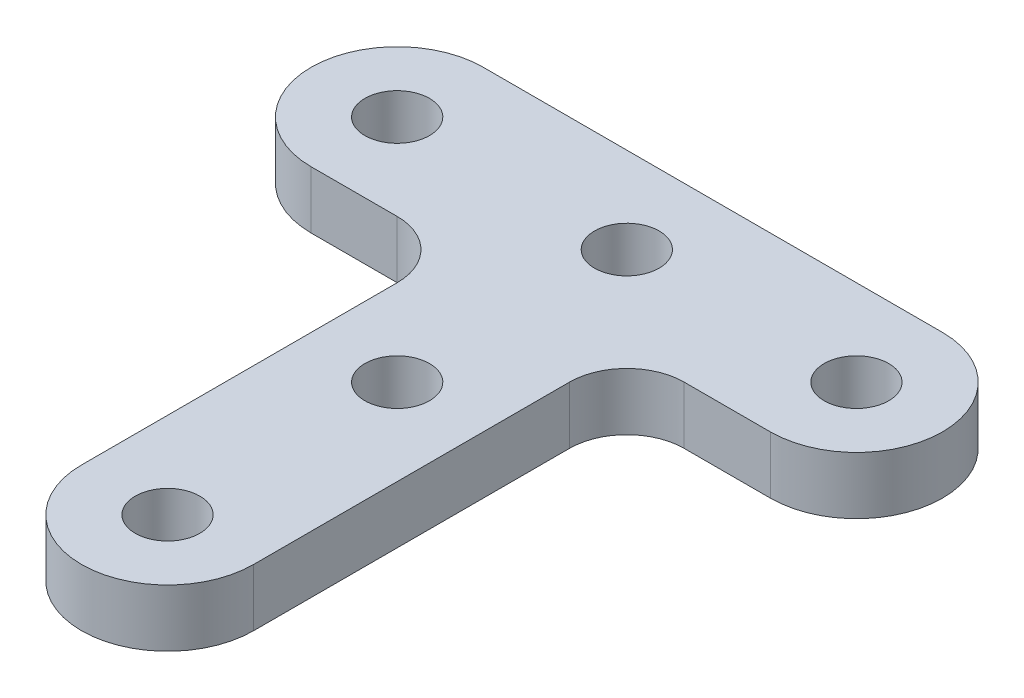
ISO-10303-21;
HEADER;
FILE_DESCRIPTION(('STEP AP214'),'2;1');
FILE_NAME('part.step','',(''),(''),'','','');
FILE_SCHEMA(('AUTOMOTIVE_DESIGN { 1 0 10303 214 1 1 1 1 }'));
ENDSEC;
DATA;
#1=APPLICATION_CONTEXT('core data for automotive mechanical design processes');
#2=APPLICATION_PROTOCOL_DEFINITION('international standard','automotive_design',2000,#1);
#3=PRODUCT_CONTEXT('',#1,'mechanical');
#4=PRODUCT('Part','Part','',(#3));
#5=PRODUCT_RELATED_PRODUCT_CATEGORY('part','',(#4));
#6=PRODUCT_DEFINITION_FORMATION('','',#4);
#7=PRODUCT_DEFINITION_CONTEXT('part definition',#1,'design');
#8=PRODUCT_DEFINITION('design','',#6,#7);
#9=PRODUCT_DEFINITION_SHAPE('','',#8);
#10=(LENGTH_UNIT() NAMED_UNIT(*) SI_UNIT(.MILLI.,.METRE.));
#11=(NAMED_UNIT(*) PLANE_ANGLE_UNIT() SI_UNIT($,.RADIAN.));
#12=(NAMED_UNIT(*) SI_UNIT($,.STERADIAN.) SOLID_ANGLE_UNIT());
#13=UNCERTAINTY_MEASURE_WITH_UNIT(LENGTH_MEASURE(1.E-05),#10,'distance_accuracy_value','');
#14=(GEOMETRIC_REPRESENTATION_CONTEXT(3) GLOBAL_UNCERTAINTY_ASSIGNED_CONTEXT((#13)) GLOBAL_UNIT_ASSIGNED_CONTEXT((#10,
#11,#12)) REPRESENTATION_CONTEXT('',''));
#15=CARTESIAN_POINT('',(0.,0.,0.));
#16=DIRECTION('',(0.,0.,1.));
#17=DIRECTION('',(1.,0.,0.));
#18=AXIS2_PLACEMENT_3D('',#15,#16,#17);
#19=CARTESIAN_POINT('',(24.961912484,125.727574554,1112.575334154));
#20=DIRECTION('',(0.,1.,0.));
#21=DIRECTION('',(0.,0.,1.));
#22=AXIS2_PLACEMENT_3D('',#19,#20,#21);
#23=CYLINDRICAL_SURFACE('',#22,9.52500000000001);
#24=CARTESIAN_POINT('',(24.961912484,132.077574554,1112.575334154));
#25=DIRECTION('',(0.,-1.,0.));
#26=DIRECTION('',(0.,0.,-1.));
#27=AXIS2_PLACEMENT_3D('',#24,#25,#26);
#28=CIRCLE('',#27,9.52500000000001);
#29=CARTESIAN_POINT('',(24.961912484,132.077574554,1103.050334154));
#30=VERTEX_POINT('',#29);
#31=CARTESIAN_POINT('',(24.961912484,132.077574554,1122.100334154));
#32=VERTEX_POINT('',#31);
#33=EDGE_CURVE('E140',#30,#32,#28,.T.);
#34=ORIENTED_EDGE('',*,*,#33,.T.);
#35=DIRECTION('',(0.,1.,0.));
#36=VECTOR('',#35,1.);
#37=CARTESIAN_POINT('',(24.961912484,125.727574554,1122.100334154));
#38=LINE('',#37,#36);
#39=CARTESIAN_POINT('',(24.961912484,125.727574554,1122.100334154));
#40=VERTEX_POINT('',#39);
#41=EDGE_CURVE('E121',#40,#32,#38,.T.);
#42=ORIENTED_EDGE('',*,*,#41,.F.);
#43=CARTESIAN_POINT('',(24.961912484,125.727574554,1112.575334154));
#44=DIRECTION('',(0.,-1.,0.));
#45=DIRECTION('',(0.,0.,-1.));
#46=AXIS2_PLACEMENT_3D('',#43,#44,#45);
#47=CIRCLE('',#46,9.52500000000001);
#48=CARTESIAN_POINT('',(24.961912484,125.727574554,1103.050334154));
#49=VERTEX_POINT('',#48);
#50=EDGE_CURVE('E128',#49,#40,#47,.T.);
#51=ORIENTED_EDGE('',*,*,#50,.F.);
#52=DIRECTION('',(0.,1.,0.));
#53=VECTOR('',#52,1.);
#54=CARTESIAN_POINT('',(24.961912484,125.727574554,1103.050334154));
#55=LINE('',#54,#53);
#56=EDGE_CURVE('E189',#49,#30,#55,.T.);
#57=ORIENTED_EDGE('',*,*,#56,.T.);
#58=EDGE_LOOP('',(#34,#42,#51,#57));
#59=FACE_BOUND('',#58,.T.);
#60=ADVANCED_FACE('F39',(#59),#23,.T.);
#61=CARTESIAN_POINT('',(24.961912484,125.727574554,1122.100334154));
#62=DIRECTION('',(0.,0.,-1.));
#63=DIRECTION('',(-1.,0.,0.));
#64=AXIS2_PLACEMENT_3D('',#61,#62,#63);
#65=PLANE('',#64);
#66=DIRECTION('',(-1.,0.,0.));
#67=VECTOR('',#66,1.);
#68=CARTESIAN_POINT('',(24.961912484,132.077574554,1122.100334154));
#69=LINE('',#68,#67);
#70=CARTESIAN_POINT('',(15.436912484,132.077574554,1122.100334154));
#71=VERTEX_POINT('',#70);
#72=EDGE_CURVE('E171',#32,#71,#69,.T.);
#73=ORIENTED_EDGE('',*,*,#72,.T.);
#74=DIRECTION('',(0.,1.,0.));
#75=VECTOR('',#74,1.);
#76=CARTESIAN_POINT('',(15.436912484,125.727574554,1122.100334154));
#77=LINE('',#76,#75);
#78=CARTESIAN_POINT('',(15.436912484,125.727574554,1122.100334154));
#79=VERTEX_POINT('',#78);
#80=EDGE_CURVE('E124',#71,#79,#77,.F.);
#81=ORIENTED_EDGE('',*,*,#80,.T.);
#82=DIRECTION('',(-1.,0.,0.));
#83=VECTOR('',#82,1.);
#84=CARTESIAN_POINT('',(24.961912484,125.727574554,1122.100334154));
#85=LINE('',#84,#83);
#86=EDGE_CURVE('E116',#40,#79,#85,.T.);
#87=ORIENTED_EDGE('',*,*,#86,.F.);
#88=ORIENTED_EDGE('',*,*,#41,.T.);
#89=EDGE_LOOP('',(#73,#81,#87,#88));
#90=FACE_BOUND('',#89,.T.);
#91=ADVANCED_FACE('F119',(#90),#65,.F.);
#92=CARTESIAN_POINT('',(9.08691248399996,125.727574554,1122.100334154));
#93=DIRECTION('',(-1.,0.,0.));
#94=DIRECTION('',(0.,0.,1.));
#95=AXIS2_PLACEMENT_3D('',#92,#93,#94);
#96=PLANE('',#95);
#97=DIRECTION('',(0.,0.,1.));
#98=VECTOR('',#97,1.);
#99=CARTESIAN_POINT('',(9.08691248399996,125.727574554,1122.100334154));
#100=LINE('',#99,#98);
#101=CARTESIAN_POINT('',(9.08691248399996,125.727574554,1128.450334154));
#102=VERTEX_POINT('',#101);
#103=CARTESIAN_POINT('',(9.08691248399996,125.727574554,1163.375334154));
#104=VERTEX_POINT('',#103);
#105=EDGE_CURVE('E127',#102,#104,#100,.T.);
#106=ORIENTED_EDGE('',*,*,#105,.F.);
#107=DIRECTION('',(0.,1.,0.));
#108=VECTOR('',#107,1.);
#109=CARTESIAN_POINT('',(9.08691248399996,132.077574554,1128.450334154));
#110=LINE('',#109,#108);
#111=CARTESIAN_POINT('',(9.08691248399996,132.077574554,1128.450334154));
#112=VERTEX_POINT('',#111);
#113=EDGE_CURVE('E141',#102,#112,#110,.T.);
#114=ORIENTED_EDGE('',*,*,#113,.T.);
#115=DIRECTION('',(0.,0.,1.));
#116=VECTOR('',#115,1.);
#117=CARTESIAN_POINT('',(9.08691248399996,132.077574554,1122.100334154));
#118=LINE('',#117,#116);
#119=CARTESIAN_POINT('',(9.08691248399996,132.077574554,1163.375334154));
#120=VERTEX_POINT('',#119);
#121=EDGE_CURVE('E173',#112,#120,#118,.T.);
#122=ORIENTED_EDGE('',*,*,#121,.T.);
#123=DIRECTION('',(0.,1.,0.));
#124=VECTOR('',#123,1.);
#125=CARTESIAN_POINT('',(9.08691248399996,125.727574554,1163.375334154));
#126=LINE('',#125,#124);
#127=EDGE_CURVE('E142',#104,#120,#126,.T.);
#128=ORIENTED_EDGE('',*,*,#127,.F.);
#129=EDGE_LOOP('',(#106,#114,#122,#128));
#130=FACE_BOUND('',#129,.T.);
#131=ADVANCED_FACE('F164',(#130),#96,.F.);
#132=CARTESIAN_POINT('',(-0.438087516000038,125.727574554,1163.375334154));
#133=DIRECTION('',(0.,1.,0.));
#134=DIRECTION('',(0.,0.,1.));
#135=AXIS2_PLACEMENT_3D('',#132,#133,#134);
#136=CYLINDRICAL_SURFACE('',#135,9.525);
#137=CARTESIAN_POINT('',(-0.438087516000038,132.077574554,1163.375334154));
#138=DIRECTION('',(0.,-1.,0.));
#139=DIRECTION('',(0.,0.,-1.));
#140=AXIS2_PLACEMENT_3D('',#137,#138,#139);
#141=CIRCLE('',#140,9.525);
#142=CARTESIAN_POINT('',(-9.96308751600004,132.077574554,1163.375334154));
#143=VERTEX_POINT('',#142);
#144=EDGE_CURVE('E175',#120,#143,#141,.T.);
#145=ORIENTED_EDGE('',*,*,#144,.T.);
#146=DIRECTION('',(0.,1.,0.));
#147=VECTOR('',#146,1.);
#148=CARTESIAN_POINT('',(-9.96308751600004,125.727574554,1163.375334154));
#149=LINE('',#148,#147);
#150=CARTESIAN_POINT('',(-9.96308751600004,125.727574554,1163.375334154));
#151=VERTEX_POINT('',#150);
#152=EDGE_CURVE('E147',#151,#143,#149,.T.);
#153=ORIENTED_EDGE('',*,*,#152,.F.);
#154=CARTESIAN_POINT('',(-0.438087516000038,125.727574554,1163.375334154));
#155=DIRECTION('',(0.,-1.,0.));
#156=DIRECTION('',(0.,0.,-1.));
#157=AXIS2_PLACEMENT_3D('',#154,#155,#156);
#158=CIRCLE('',#157,9.525);
#159=EDGE_CURVE('E167',#104,#151,#158,.T.);
#160=ORIENTED_EDGE('',*,*,#159,.F.);
#161=ORIENTED_EDGE('',*,*,#127,.T.);
#162=EDGE_LOOP('',(#145,#153,#160,#161));
#163=FACE_BOUND('',#162,.T.);
#164=ADVANCED_FACE('F201',(#163),#136,.T.);
#165=CARTESIAN_POINT('',(-9.96308751600004,125.727574554,1163.375334154));
#166=DIRECTION('',(1.,0.,0.));
#167=DIRECTION('',(0.,0.,-1.));
#168=AXIS2_PLACEMENT_3D('',#165,#166,#167);
#169=PLANE('',#168);
#170=DIRECTION('',(0.,0.,-1.));
#171=VECTOR('',#170,1.);
#172=CARTESIAN_POINT('',(-9.96308751600004,132.077574554,1163.375334154));
#173=LINE('',#172,#171);
#174=CARTESIAN_POINT('',(-9.96308751600004,132.077574554,1128.450334154));
#175=VERTEX_POINT('',#174);
#176=EDGE_CURVE('E182',#143,#175,#173,.T.);
#177=ORIENTED_EDGE('',*,*,#176,.T.);
#178=DIRECTION('',(0.,1.,0.));
#179=VECTOR('',#178,1.);
#180=CARTESIAN_POINT('',(-9.96308751600004,125.727574554,1128.450334154));
#181=LINE('',#180,#179);
#182=CARTESIAN_POINT('',(-9.96308751600004,125.727574554,1128.450334154));
#183=VERTEX_POINT('',#182);
#184=EDGE_CURVE('E54',#175,#183,#181,.F.);
#185=ORIENTED_EDGE('',*,*,#184,.T.);
#186=DIRECTION('',(0.,0.,-1.));
#187=VECTOR('',#186,1.);
#188=CARTESIAN_POINT('',(-9.96308751600004,125.727574554,1163.375334154));
#189=LINE('',#188,#187);
#190=EDGE_CURVE('E199',#151,#183,#189,.T.);
#191=ORIENTED_EDGE('',*,*,#190,.F.);
#192=ORIENTED_EDGE('',*,*,#152,.T.);
#193=EDGE_LOOP('',(#177,#185,#191,#192));
#194=FACE_BOUND('',#193,.T.);
#195=ADVANCED_FACE('F198',(#194),#169,.F.);
#196=CARTESIAN_POINT('',(-9.96308751600004,125.727574554,1122.100334154));
#197=DIRECTION('',(0.,0.,-1.));
#198=DIRECTION('',(-1.,0.,0.));
#199=AXIS2_PLACEMENT_3D('',#196,#197,#198);
#200=PLANE('',#199);
#201=DIRECTION('',(-1.,0.,0.));
#202=VECTOR('',#201,1.);
#203=CARTESIAN_POINT('',(-9.96308751600004,125.727574554,1122.100334154));
#204=LINE('',#203,#202);
#205=CARTESIAN_POINT('',(-16.313087516,125.727574554,1122.100334154));
#206=VERTEX_POINT('',#205);
#207=CARTESIAN_POINT('',(-25.838087516,125.727574554,1122.100334154));
#208=VERTEX_POINT('',#207);
#209=EDGE_CURVE('E203',#206,#208,#204,.T.);
#210=ORIENTED_EDGE('',*,*,#209,.F.);
#211=DIRECTION('',(0.,1.,0.));
#212=VECTOR('',#211,1.);
#213=CARTESIAN_POINT('',(-16.313087516,132.077574554,1122.100334154));
#214=LINE('',#213,#212);
#215=CARTESIAN_POINT('',(-16.313087516,132.077574554,1122.100334154));
#216=VERTEX_POINT('',#215);
#217=EDGE_CURVE('E152',#206,#216,#214,.T.);
#218=ORIENTED_EDGE('',*,*,#217,.T.);
#219=DIRECTION('',(-1.,0.,0.));
#220=VECTOR('',#219,1.);
#221=CARTESIAN_POINT('',(-9.96308751600004,132.077574554,1122.100334154));
#222=LINE('',#221,#220);
#223=CARTESIAN_POINT('',(-25.838087516,132.077574554,1122.100334154));
#224=VERTEX_POINT('',#223);
#225=EDGE_CURVE('E184',#216,#224,#222,.T.);
#226=ORIENTED_EDGE('',*,*,#225,.T.);
#227=DIRECTION('',(0.,1.,0.));
#228=VECTOR('',#227,1.);
#229=CARTESIAN_POINT('',(-25.838087516,125.727574554,1122.100334154));
#230=LINE('',#229,#228);
#231=EDGE_CURVE('E194',#208,#224,#230,.T.);
#232=ORIENTED_EDGE('',*,*,#231,.F.);
#233=EDGE_LOOP('',(#210,#218,#226,#232));
#234=FACE_BOUND('',#233,.T.);
#235=ADVANCED_FACE('F219',(#234),#200,.F.);
#236=CARTESIAN_POINT('',(-25.838087516,125.727574554,1112.575334154));
#237=DIRECTION('',(0.,1.,0.));
#238=DIRECTION('',(0.,0.,1.));
#239=AXIS2_PLACEMENT_3D('',#236,#237,#238);
#240=CYLINDRICAL_SURFACE('',#239,9.52500000000001);
#241=CARTESIAN_POINT('',(-25.838087516,132.077574554,1112.575334154));
#242=DIRECTION('',(0.,-1.,0.));
#243=DIRECTION('',(0.,0.,-1.));
#244=AXIS2_PLACEMENT_3D('',#241,#242,#243);
#245=CIRCLE('',#244,9.52500000000001);
#246=CARTESIAN_POINT('',(-25.838087516,132.077574554,1103.050334154));
#247=VERTEX_POINT('',#246);
#248=EDGE_CURVE('E186',#224,#247,#245,.T.);
#249=ORIENTED_EDGE('',*,*,#248,.T.);
#250=DIRECTION('',(0.,1.,0.));
#251=VECTOR('',#250,1.);
#252=CARTESIAN_POINT('',(-25.838087516,125.727574554,1103.050334154));
#253=LINE('',#252,#251);
#254=CARTESIAN_POINT('',(-25.838087516,125.727574554,1103.050334154));
#255=VERTEX_POINT('',#254);
#256=EDGE_CURVE('E191',#255,#247,#253,.T.);
#257=ORIENTED_EDGE('',*,*,#256,.F.);
#258=CARTESIAN_POINT('',(-25.838087516,125.727574554,1112.575334154));
#259=DIRECTION('',(0.,-1.,0.));
#260=DIRECTION('',(0.,0.,-1.));
#261=AXIS2_PLACEMENT_3D('',#258,#259,#260);
#262=CIRCLE('',#261,9.52500000000001);
#263=EDGE_CURVE('E207',#208,#255,#262,.T.);
#264=ORIENTED_EDGE('',*,*,#263,.F.);
#265=ORIENTED_EDGE('',*,*,#231,.T.);
#266=EDGE_LOOP('',(#249,#257,#264,#265));
#267=FACE_BOUND('',#266,.T.);
#268=ADVANCED_FACE('F213',(#267),#240,.T.);
#269=CARTESIAN_POINT('',(24.961912484,125.727574554,1103.050334154));
#270=DIRECTION('',(0.,0.,1.));
#271=DIRECTION('',(1.,0.,0.));
#272=AXIS2_PLACEMENT_3D('',#269,#270,#271);
#273=PLANE('',#272);
#274=DIRECTION('',(1.,0.,0.));
#275=VECTOR('',#274,1.);
#276=CARTESIAN_POINT('',(24.961912484,132.077574554,1103.050334154));
#277=LINE('',#276,#275);
#278=EDGE_CURVE('E137',#247,#30,#277,.T.);
#279=ORIENTED_EDGE('',*,*,#278,.T.);
#280=ORIENTED_EDGE('',*,*,#56,.F.);
#281=DIRECTION('',(1.,0.,0.));
#282=VECTOR('',#281,1.);
#283=CARTESIAN_POINT('',(24.961912484,125.727574554,1103.050334154));
#284=LINE('',#283,#282);
#285=EDGE_CURVE('E133',#255,#49,#284,.T.);
#286=ORIENTED_EDGE('',*,*,#285,.F.);
#287=ORIENTED_EDGE('',*,*,#256,.T.);
#288=EDGE_LOOP('',(#279,#280,#286,#287));
#289=FACE_BOUND('',#288,.T.);
#290=ADVANCED_FACE('F217',(#289),#273,.F.);
#291=CARTESIAN_POINT('',(24.961912484,125.727574554,1112.575334154));
#292=DIRECTION('',(0.,-1.,0.));
#293=DIRECTION('',(0.,0.,-1.));
#294=AXIS2_PLACEMENT_3D('',#291,#292,#293);
#295=PLANE('',#294);
#296=CARTESIAN_POINT('',(24.961912484,125.727574554,1112.575334154));
#297=DIRECTION('',(0.,-1.,0.));
#298=DIRECTION('',(0.,0.,-1.));
#299=AXIS2_PLACEMENT_3D('',#296,#297,#298);
#300=CIRCLE('',#299,3.57123999999999);
#301=CARTESIAN_POINT('',(24.961912484,125.727574554,1109.004094154));
#302=VERTEX_POINT('',#301);
#303=EDGE_CURVE('E279',#302,#302,#300,.T.);
#304=ORIENTED_EDGE('',*,*,#303,.F.);
#305=EDGE_LOOP('',(#304));
#306=FACE_BOUND('',#305,.T.);
#307=CARTESIAN_POINT('',(-25.838087516,125.727574554,1112.575334154));
#308=DIRECTION('',(0.,-1.,0.));
#309=DIRECTION('',(0.,0.,-1.));
#310=AXIS2_PLACEMENT_3D('',#307,#308,#309);
#311=CIRCLE('',#310,3.57123999999999);
#312=CARTESIAN_POINT('',(-25.838087516,125.727574554,1109.004094154));
#313=VERTEX_POINT('',#312);
#314=EDGE_CURVE('E281',#313,#313,#311,.T.);
#315=ORIENTED_EDGE('',*,*,#314,.F.);
#316=EDGE_LOOP('',(#315));
#317=FACE_BOUND('',#316,.T.);
#318=CARTESIAN_POINT('',(-0.438087516000038,125.727574554,1137.975334154));
#319=DIRECTION('',(0.,-1.,0.));
#320=DIRECTION('',(0.,0.,-1.));
#321=AXIS2_PLACEMENT_3D('',#318,#319,#320);
#322=CIRCLE('',#321,3.57123999999999);
#323=CARTESIAN_POINT('',(-0.438087516000038,125.727574554,1134.404094154));
#324=VERTEX_POINT('',#323);
#325=EDGE_CURVE('E289',#324,#324,#322,.T.);
#326=ORIENTED_EDGE('',*,*,#325,.F.);
#327=EDGE_LOOP('',(#326));
#328=FACE_BOUND('',#327,.T.);
#329=CARTESIAN_POINT('',(-0.438087516000038,125.727574554,1163.375334154));
#330=DIRECTION('',(0.,-1.,0.));
#331=DIRECTION('',(0.,0.,-1.));
#332=AXIS2_PLACEMENT_3D('',#329,#330,#331);
#333=CIRCLE('',#332,3.57123999999999);
#334=CARTESIAN_POINT('',(-0.438087516000038,125.727574554,1159.804094154));
#335=VERTEX_POINT('',#334);
#336=EDGE_CURVE('E295',#335,#335,#333,.T.);
#337=ORIENTED_EDGE('',*,*,#336,.F.);
#338=EDGE_LOOP('',(#337));
#339=FACE_BOUND('',#338,.T.);
#340=CARTESIAN_POINT('',(-0.438087516000038,125.727574554,1112.575334154));
#341=DIRECTION('',(0.,-1.,0.));
#342=DIRECTION('',(0.,0.,-1.));
#343=AXIS2_PLACEMENT_3D('',#340,#341,#342);
#344=CIRCLE('',#343,3.57123999999999);
#345=CARTESIAN_POINT('',(-0.438087516000038,125.727574554,1109.004094154));
#346=VERTEX_POINT('',#345);
#347=EDGE_CURVE('E301',#346,#346,#344,.T.);
#348=ORIENTED_EDGE('',*,*,#347,.F.);
#349=EDGE_LOOP('',(#348));
#350=FACE_BOUND('',#349,.T.);
#351=ORIENTED_EDGE('',*,*,#50,.T.);
#352=ORIENTED_EDGE('',*,*,#86,.T.);
#353=CARTESIAN_POINT('',(15.436912484,125.727574554,1128.450334154));
#354=DIRECTION('',(0.,-1.,0.));
#355=DIRECTION('',(0.,0.,-1.));
#356=AXIS2_PLACEMENT_3D('',#353,#354,#355);
#357=CIRCLE('',#356,6.35);
#358=EDGE_CURVE('E158',#79,#102,#357,.F.);
#359=ORIENTED_EDGE('',*,*,#358,.T.);
#360=ORIENTED_EDGE('',*,*,#105,.T.);
#361=ORIENTED_EDGE('',*,*,#159,.T.);
#362=ORIENTED_EDGE('',*,*,#190,.T.);
#363=CARTESIAN_POINT('',(-16.313087516,125.727574554,1128.450334154));
#364=DIRECTION('',(0.,-1.,0.));
#365=DIRECTION('',(0.,0.,-1.));
#366=AXIS2_PLACEMENT_3D('',#363,#364,#365);
#367=CIRCLE('',#366,6.35);
#368=EDGE_CURVE('E11',#183,#206,#367,.F.);
#369=ORIENTED_EDGE('',*,*,#368,.T.);
#370=ORIENTED_EDGE('',*,*,#209,.T.);
#371=ORIENTED_EDGE('',*,*,#263,.T.);
#372=ORIENTED_EDGE('',*,*,#285,.T.);
#373=EDGE_LOOP('',(#351,#352,#359,#360,#361,#362,#369,#370,#371,#372));
#374=FACE_BOUND('',#373,.T.);
#375=ADVANCED_FACE('F131',(#306,#317,#328,#339,#350,#374),#295,.T.);
#376=CARTESIAN_POINT('',(24.961912484,132.077574554,1112.575334154));
#377=DIRECTION('',(0.,-1.,0.));
#378=DIRECTION('',(0.,0.,-1.));
#379=AXIS2_PLACEMENT_3D('',#376,#377,#378);
#380=PLANE('',#379);
#381=CARTESIAN_POINT('',(24.961912484,132.077574554,1112.575334154));
#382=DIRECTION('',(0.,-1.,0.));
#383=DIRECTION('',(0.,0.,-1.));
#384=AXIS2_PLACEMENT_3D('',#381,#382,#383);
#385=CIRCLE('',#384,3.57124);
#386=CARTESIAN_POINT('',(24.961912484,132.077574554,1109.004094154));
#387=VERTEX_POINT('',#386);
#388=EDGE_CURVE('E276',#387,#387,#385,.T.);
#389=ORIENTED_EDGE('',*,*,#388,.T.);
#390=EDGE_LOOP('',(#389));
#391=FACE_BOUND('',#390,.T.);
#392=CARTESIAN_POINT('',(-25.838087516,132.077574554,1112.575334154));
#393=DIRECTION('',(0.,-1.,0.));
#394=DIRECTION('',(0.,0.,-1.));
#395=AXIS2_PLACEMENT_3D('',#392,#393,#394);
#396=CIRCLE('',#395,3.57124);
#397=CARTESIAN_POINT('',(-25.838087516,132.077574554,1109.004094154));
#398=VERTEX_POINT('',#397);
#399=EDGE_CURVE('E286',#398,#398,#396,.T.);
#400=ORIENTED_EDGE('',*,*,#399,.T.);
#401=EDGE_LOOP('',(#400));
#402=FACE_BOUND('',#401,.T.);
#403=CARTESIAN_POINT('',(-0.438087516000038,132.077574554,1137.975334154));
#404=DIRECTION('',(0.,-1.,0.));
#405=DIRECTION('',(0.,0.,-1.));
#406=AXIS2_PLACEMENT_3D('',#403,#404,#405);
#407=CIRCLE('',#406,3.57124);
#408=CARTESIAN_POINT('',(-0.438087516000038,132.077574554,1134.404094154));
#409=VERTEX_POINT('',#408);
#410=EDGE_CURVE('E292',#409,#409,#407,.T.);
#411=ORIENTED_EDGE('',*,*,#410,.T.);
#412=EDGE_LOOP('',(#411));
#413=FACE_BOUND('',#412,.T.);
#414=CARTESIAN_POINT('',(-0.438087516000038,132.077574554,1163.375334154));
#415=DIRECTION('',(0.,-1.,0.));
#416=DIRECTION('',(0.,0.,-1.));
#417=AXIS2_PLACEMENT_3D('',#414,#415,#416);
#418=CIRCLE('',#417,3.57124);
#419=CARTESIAN_POINT('',(-0.438087516000038,132.077574554,1159.804094154));
#420=VERTEX_POINT('',#419);
#421=EDGE_CURVE('E298',#420,#420,#418,.T.);
#422=ORIENTED_EDGE('',*,*,#421,.T.);
#423=EDGE_LOOP('',(#422));
#424=FACE_BOUND('',#423,.T.);
#425=CARTESIAN_POINT('',(-0.438087516000038,132.077574554,1112.575334154));
#426=DIRECTION('',(0.,-1.,0.));
#427=DIRECTION('',(0.,0.,-1.));
#428=AXIS2_PLACEMENT_3D('',#425,#426,#427);
#429=CIRCLE('',#428,3.57124);
#430=CARTESIAN_POINT('',(-0.438087516000038,132.077574554,1109.004094154));
#431=VERTEX_POINT('',#430);
#432=EDGE_CURVE('E177',#431,#431,#429,.T.);
#433=ORIENTED_EDGE('',*,*,#432,.T.);
#434=EDGE_LOOP('',(#433));
#435=FACE_BOUND('',#434,.T.);
#436=ORIENTED_EDGE('',*,*,#33,.F.);
#437=ORIENTED_EDGE('',*,*,#278,.F.);
#438=ORIENTED_EDGE('',*,*,#248,.F.);
#439=ORIENTED_EDGE('',*,*,#225,.F.);
#440=CARTESIAN_POINT('',(-16.313087516,132.077574554,1128.450334154));
#441=DIRECTION('',(0.,-1.,0.));
#442=DIRECTION('',(0.,0.,-1.));
#443=AXIS2_PLACEMENT_3D('',#440,#441,#442);
#444=CIRCLE('',#443,6.35);
#445=EDGE_CURVE('E47',#216,#175,#444,.T.);
#446=ORIENTED_EDGE('',*,*,#445,.T.);
#447=ORIENTED_EDGE('',*,*,#176,.F.);
#448=ORIENTED_EDGE('',*,*,#144,.F.);
#449=ORIENTED_EDGE('',*,*,#121,.F.);
#450=CARTESIAN_POINT('',(15.436912484,132.077574554,1128.450334154));
#451=DIRECTION('',(0.,-1.,0.));
#452=DIRECTION('',(0.,0.,-1.));
#453=AXIS2_PLACEMENT_3D('',#450,#451,#452);
#454=CIRCLE('',#453,6.35);
#455=EDGE_CURVE('E156',#112,#71,#454,.T.);
#456=ORIENTED_EDGE('',*,*,#455,.T.);
#457=ORIENTED_EDGE('',*,*,#72,.F.);
#458=EDGE_LOOP('',(#436,#437,#438,#439,#446,#447,#448,#449,#456,#457));
#459=FACE_BOUND('',#458,.T.);
#460=ADVANCED_FACE('F170',(#391,#402,#413,#424,#435,#459),#380,.F.);
#461=CARTESIAN_POINT('',(15.436912484,125.727574554,1128.450334154));
#462=DIRECTION('',(0.,-1.,0.));
#463=DIRECTION('',(0.,0.,-1.));
#464=AXIS2_PLACEMENT_3D('',#461,#462,#463);
#465=CYLINDRICAL_SURFACE('',#464,6.35);
#466=ORIENTED_EDGE('',*,*,#358,.F.);
#467=ORIENTED_EDGE('',*,*,#80,.F.);
#468=ORIENTED_EDGE('',*,*,#455,.F.);
#469=ORIENTED_EDGE('',*,*,#113,.F.);
#470=EDGE_LOOP('',(#466,#467,#468,#469));
#471=FACE_BOUND('',#470,.T.);
#472=ADVANCED_FACE('F169',(#471),#465,.F.);
#473=CARTESIAN_POINT('',(-16.313087516,125.727574554,1128.450334154));
#474=DIRECTION('',(0.,-1.,0.));
#475=DIRECTION('',(0.,0.,-1.));
#476=AXIS2_PLACEMENT_3D('',#473,#474,#475);
#477=CYLINDRICAL_SURFACE('',#476,6.35);
#478=ORIENTED_EDGE('',*,*,#368,.F.);
#479=ORIENTED_EDGE('',*,*,#184,.F.);
#480=ORIENTED_EDGE('',*,*,#445,.F.);
#481=ORIENTED_EDGE('',*,*,#217,.F.);
#482=EDGE_LOOP('',(#478,#479,#480,#481));
#483=FACE_BOUND('',#482,.T.);
#484=ADVANCED_FACE('F41',(#483),#477,.F.);
#485=CARTESIAN_POINT('',(-0.438087516000038,125.727574554,1112.575334154));
#486=DIRECTION('',(0.,-1.,0.));
#487=DIRECTION('',(0.,0.,-1.));
#488=AXIS2_PLACEMENT_3D('',#485,#486,#487);
#489=CYLINDRICAL_SURFACE('',#488,3.57123999999999);
#490=ORIENTED_EDGE('',*,*,#432,.F.);
#491=EDGE_LOOP('',(#490));
#492=FACE_BOUND('',#491,.T.);
#493=ORIENTED_EDGE('',*,*,#347,.T.);
#494=EDGE_LOOP('',(#493));
#495=FACE_BOUND('',#494,.T.);
#496=ADVANCED_FACE('F224',(#492,#495),#489,.F.);
#497=CARTESIAN_POINT('',(-0.438087516000038,125.727574554,1163.375334154));
#498=DIRECTION('',(0.,-1.,0.));
#499=DIRECTION('',(0.,0.,-1.));
#500=AXIS2_PLACEMENT_3D('',#497,#498,#499);
#501=CYLINDRICAL_SURFACE('',#500,3.57123999999999);
#502=ORIENTED_EDGE('',*,*,#421,.F.);
#503=EDGE_LOOP('',(#502));
#504=FACE_BOUND('',#503,.T.);
#505=ORIENTED_EDGE('',*,*,#336,.T.);
#506=EDGE_LOOP('',(#505));
#507=FACE_BOUND('',#506,.T.);
#508=ADVANCED_FACE('F230',(#504,#507),#501,.F.);
#509=CARTESIAN_POINT('',(-0.438087516000038,125.727574554,1137.975334154));
#510=DIRECTION('',(0.,-1.,0.));
#511=DIRECTION('',(0.,0.,-1.));
#512=AXIS2_PLACEMENT_3D('',#509,#510,#511);
#513=CYLINDRICAL_SURFACE('',#512,3.57123999999999);
#514=ORIENTED_EDGE('',*,*,#410,.F.);
#515=EDGE_LOOP('',(#514));
#516=FACE_BOUND('',#515,.T.);
#517=ORIENTED_EDGE('',*,*,#325,.T.);
#518=EDGE_LOOP('',(#517));
#519=FACE_BOUND('',#518,.T.);
#520=ADVANCED_FACE('F259',(#516,#519),#513,.F.);
#521=CARTESIAN_POINT('',(-25.838087516,125.727574554,1112.575334154));
#522=DIRECTION('',(0.,-1.,0.));
#523=DIRECTION('',(0.,0.,-1.));
#524=AXIS2_PLACEMENT_3D('',#521,#522,#523);
#525=CYLINDRICAL_SURFACE('',#524,3.57123999999999);
#526=ORIENTED_EDGE('',*,*,#399,.F.);
#527=EDGE_LOOP('',(#526));
#528=FACE_BOUND('',#527,.T.);
#529=ORIENTED_EDGE('',*,*,#314,.T.);
#530=EDGE_LOOP('',(#529));
#531=FACE_BOUND('',#530,.T.);
#532=ADVANCED_FACE('F263',(#528,#531),#525,.F.);
#533=CARTESIAN_POINT('',(24.961912484,125.727574554,1112.575334154));
#534=DIRECTION('',(0.,-1.,0.));
#535=DIRECTION('',(0.,0.,-1.));
#536=AXIS2_PLACEMENT_3D('',#533,#534,#535);
#537=CYLINDRICAL_SURFACE('',#536,3.57123999999999);
#538=ORIENTED_EDGE('',*,*,#388,.F.);
#539=EDGE_LOOP('',(#538));
#540=FACE_BOUND('',#539,.T.);
#541=ORIENTED_EDGE('',*,*,#303,.T.);
#542=EDGE_LOOP('',(#541));
#543=FACE_BOUND('',#542,.T.);
#544=ADVANCED_FACE('F267',(#540,#543),#537,.F.);
#545=CLOSED_SHELL('',(#60,#91,#131,#164,#195,#235,#268,#290,#375,#460,#472,#484,#496,#508,#520,
#532,#544));
#546=MANIFOLD_SOLID_BREP('B2',#545);
#547=ADVANCED_BREP_SHAPE_REPRESENTATION('',(#18,#546),#14);
#548=SHAPE_DEFINITION_REPRESENTATION(#9,#547);
ENDSEC;
END-ISO-10303-21;
